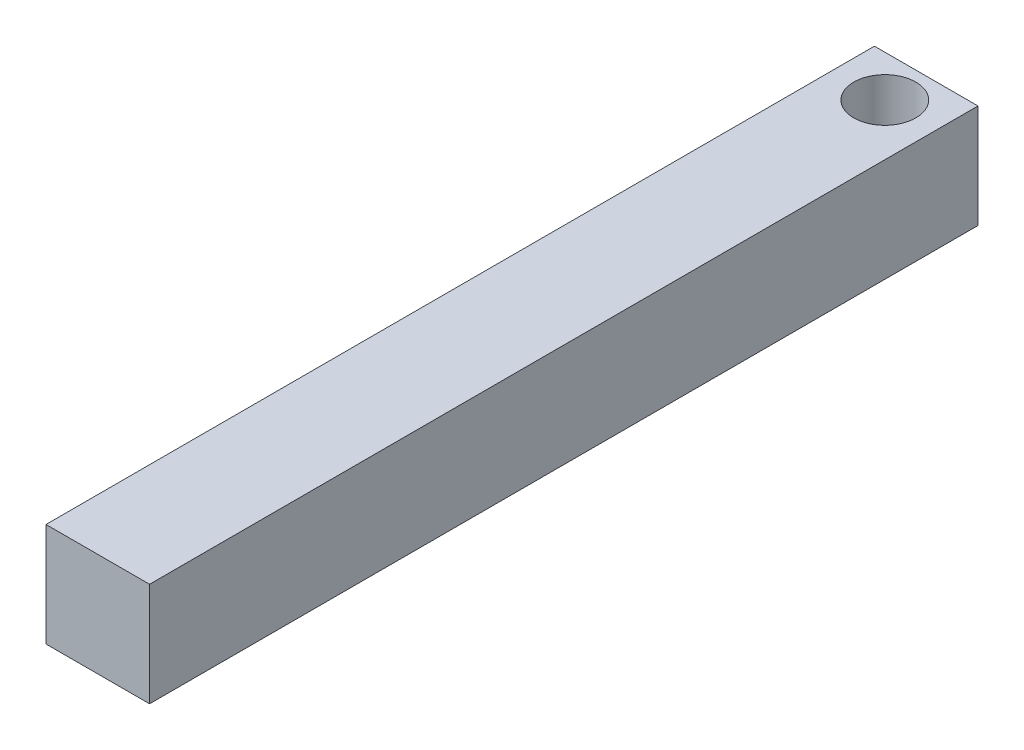
ISO-10303-21;
HEADER;
FILE_DESCRIPTION(('STEP AP214'),'2;1');
FILE_NAME('part.step','',(''),(''),'','','');
FILE_SCHEMA(('AUTOMOTIVE_DESIGN { 1 0 10303 214 1 1 1 1 }'));
ENDSEC;
DATA;
#1=APPLICATION_CONTEXT('core data for automotive mechanical design processes');
#2=APPLICATION_PROTOCOL_DEFINITION('international standard','automotive_design',2000,#1);
#3=PRODUCT_CONTEXT('',#1,'mechanical');
#4=PRODUCT('Part','Part','',(#3));
#5=PRODUCT_RELATED_PRODUCT_CATEGORY('part','',(#4));
#6=PRODUCT_DEFINITION_FORMATION('','',#4);
#7=PRODUCT_DEFINITION_CONTEXT('part definition',#1,'design');
#8=PRODUCT_DEFINITION('design','',#6,#7);
#9=PRODUCT_DEFINITION_SHAPE('','',#8);
#10=(LENGTH_UNIT() NAMED_UNIT(*) SI_UNIT(.MILLI.,.METRE.));
#11=(NAMED_UNIT(*) PLANE_ANGLE_UNIT() SI_UNIT($,.RADIAN.));
#12=(NAMED_UNIT(*) SI_UNIT($,.STERADIAN.) SOLID_ANGLE_UNIT());
#13=UNCERTAINTY_MEASURE_WITH_UNIT(LENGTH_MEASURE(1.E-05),#10,'distance_accuracy_value','');
#14=(GEOMETRIC_REPRESENTATION_CONTEXT(3) GLOBAL_UNCERTAINTY_ASSIGNED_CONTEXT((#13)) GLOBAL_UNIT_ASSIGNED_CONTEXT((#10,
#11,#12)) REPRESENTATION_CONTEXT('',''));
#15=CARTESIAN_POINT('',(0.,0.,0.));
#16=DIRECTION('',(0.,0.,1.));
#17=DIRECTION('',(1.,0.,0.));
#18=AXIS2_PLACEMENT_3D('',#15,#16,#17);
#19=CARTESIAN_POINT('',(10.,-10.,160.));
#20=DIRECTION('',(-1.,0.,0.));
#21=DIRECTION('',(0.,0.,1.));
#22=AXIS2_PLACEMENT_3D('',#19,#20,#21);
#23=PLANE('',#22);
#24=DIRECTION('',(0.,1.,0.));
#25=VECTOR('',#24,1.);
#26=CARTESIAN_POINT('',(10.,-10.,0.));
#27=LINE('',#26,#25);
#28=CARTESIAN_POINT('',(10.,-10.,0.));
#29=VERTEX_POINT('',#28);
#30=CARTESIAN_POINT('',(10.,10.,0.));
#31=VERTEX_POINT('',#30);
#32=EDGE_CURVE('E98',#29,#31,#27,.T.);
#33=ORIENTED_EDGE('',*,*,#32,.T.);
#34=DIRECTION('',(0.,0.,-1.));
#35=VECTOR('',#34,1.);
#36=CARTESIAN_POINT('',(10.,10.,160.));
#37=LINE('',#36,#35);
#38=CARTESIAN_POINT('',(10.,10.,160.));
#39=VERTEX_POINT('',#38);
#40=EDGE_CURVE('E11',#39,#31,#37,.T.);
#41=ORIENTED_EDGE('',*,*,#40,.F.);
#42=DIRECTION('',(0.,1.,0.));
#43=VECTOR('',#42,1.);
#44=CARTESIAN_POINT('',(10.,-10.,160.));
#45=LINE('',#44,#43);
#46=CARTESIAN_POINT('',(10.,-10.,160.));
#47=VERTEX_POINT('',#46);
#48=EDGE_CURVE('E85',#47,#39,#45,.T.);
#49=ORIENTED_EDGE('',*,*,#48,.F.);
#50=DIRECTION('',(0.,0.,-1.));
#51=VECTOR('',#50,1.);
#52=CARTESIAN_POINT('',(10.,-10.,160.));
#53=LINE('',#52,#51);
#54=EDGE_CURVE('E94',#47,#29,#53,.T.);
#55=ORIENTED_EDGE('',*,*,#54,.T.);
#56=EDGE_LOOP('',(#33,#41,#49,#55));
#57=FACE_BOUND('',#56,.T.);
#58=ADVANCED_FACE('F33',(#57),#23,.F.);
#59=CARTESIAN_POINT('',(-10.,10.,160.));
#60=DIRECTION('',(0.,-1.,0.));
#61=DIRECTION('',(0.,0.,-1.));
#62=AXIS2_PLACEMENT_3D('',#59,#60,#61);
#63=PLANE('',#62);
#64=CARTESIAN_POINT('',(0.,10.,8.));
#65=DIRECTION('',(0.,1.,0.));
#66=DIRECTION('',(0.,0.,1.));
#67=AXIS2_PLACEMENT_3D('',#64,#65,#66);
#68=CIRCLE('',#67,6.);
#69=CARTESIAN_POINT('',(0.,10.,14.));
#70=VERTEX_POINT('',#69);
#71=EDGE_CURVE('E111',#70,#70,#68,.T.);
#72=ORIENTED_EDGE('',*,*,#71,.F.);
#73=EDGE_LOOP('',(#72));
#74=FACE_BOUND('',#73,.T.);
#75=DIRECTION('',(-1.,0.,0.));
#76=VECTOR('',#75,1.);
#77=CARTESIAN_POINT('',(-10.,10.,0.));
#78=LINE('',#77,#76);
#79=CARTESIAN_POINT('',(-10.,10.,0.));
#80=VERTEX_POINT('',#79);
#81=EDGE_CURVE('E89',#31,#80,#78,.T.);
#82=ORIENTED_EDGE('',*,*,#81,.T.);
#83=DIRECTION('',(0.,0.,-1.));
#84=VECTOR('',#83,1.);
#85=CARTESIAN_POINT('',(-10.,10.,160.));
#86=LINE('',#85,#84);
#87=CARTESIAN_POINT('',(-10.,10.,160.));
#88=VERTEX_POINT('',#87);
#89=EDGE_CURVE('E42',#88,#80,#86,.T.);
#90=ORIENTED_EDGE('',*,*,#89,.F.);
#91=DIRECTION('',(-1.,0.,0.));
#92=VECTOR('',#91,1.);
#93=CARTESIAN_POINT('',(-10.,10.,160.));
#94=LINE('',#93,#92);
#95=EDGE_CURVE('E80',#39,#88,#94,.T.);
#96=ORIENTED_EDGE('',*,*,#95,.F.);
#97=ORIENTED_EDGE('',*,*,#40,.T.);
#98=EDGE_LOOP('',(#82,#90,#96,#97));
#99=FACE_BOUND('',#98,.T.);
#100=ADVANCED_FACE('F88',(#74,#99),#63,.F.);
#101=CARTESIAN_POINT('',(-10.,-10.,160.));
#102=DIRECTION('',(1.,0.,0.));
#103=DIRECTION('',(0.,0.,-1.));
#104=AXIS2_PLACEMENT_3D('',#101,#102,#103);
#105=PLANE('',#104);
#106=DIRECTION('',(0.,-1.,0.));
#107=VECTOR('',#106,1.);
#108=CARTESIAN_POINT('',(-10.,-10.,0.));
#109=LINE('',#108,#107);
#110=CARTESIAN_POINT('',(-10.,-10.,0.));
#111=VERTEX_POINT('',#110);
#112=EDGE_CURVE('E67',#80,#111,#109,.T.);
#113=ORIENTED_EDGE('',*,*,#112,.T.);
#114=DIRECTION('',(0.,0.,-1.));
#115=VECTOR('',#114,1.);
#116=CARTESIAN_POINT('',(-10.,-10.,160.));
#117=LINE('',#116,#115);
#118=CARTESIAN_POINT('',(-10.,-10.,160.));
#119=VERTEX_POINT('',#118);
#120=EDGE_CURVE('E90',#119,#111,#117,.T.);
#121=ORIENTED_EDGE('',*,*,#120,.F.);
#122=DIRECTION('',(0.,-1.,0.));
#123=VECTOR('',#122,1.);
#124=CARTESIAN_POINT('',(-10.,-10.,160.));
#125=LINE('',#124,#123);
#126=EDGE_CURVE('E83',#88,#119,#125,.T.);
#127=ORIENTED_EDGE('',*,*,#126,.F.);
#128=ORIENTED_EDGE('',*,*,#89,.T.);
#129=EDGE_LOOP('',(#113,#121,#127,#128));
#130=FACE_BOUND('',#129,.T.);
#131=ADVANCED_FACE('F92',(#130),#105,.F.);
#132=CARTESIAN_POINT('',(-10.,-10.,160.));
#133=DIRECTION('',(0.,1.,0.));
#134=DIRECTION('',(0.,0.,1.));
#135=AXIS2_PLACEMENT_3D('',#132,#133,#134);
#136=PLANE('',#135);
#137=CARTESIAN_POINT('',(0.,-9.99999999999999,8.));
#138=DIRECTION('',(0.,1.,0.));
#139=DIRECTION('',(0.,0.,1.));
#140=AXIS2_PLACEMENT_3D('',#137,#138,#139);
#141=CIRCLE('',#140,6.);
#142=CARTESIAN_POINT('',(0.,-9.99999999999999,14.));
#143=VERTEX_POINT('',#142);
#144=EDGE_CURVE('E36',#143,#143,#141,.T.);
#145=ORIENTED_EDGE('',*,*,#144,.T.);
#146=EDGE_LOOP('',(#145));
#147=FACE_BOUND('',#146,.T.);
#148=DIRECTION('',(1.,0.,0.));
#149=VECTOR('',#148,1.);
#150=CARTESIAN_POINT('',(-10.,-10.,0.));
#151=LINE('',#150,#149);
#152=EDGE_CURVE('E73',#111,#29,#151,.T.);
#153=ORIENTED_EDGE('',*,*,#152,.T.);
#154=ORIENTED_EDGE('',*,*,#54,.F.);
#155=DIRECTION('',(1.,0.,0.));
#156=VECTOR('',#155,1.);
#157=CARTESIAN_POINT('',(-10.,-10.,160.));
#158=LINE('',#157,#156);
#159=EDGE_CURVE('E50',#119,#47,#158,.T.);
#160=ORIENTED_EDGE('',*,*,#159,.F.);
#161=ORIENTED_EDGE('',*,*,#120,.T.);
#162=EDGE_LOOP('',(#153,#154,#160,#161));
#163=FACE_BOUND('',#162,.T.);
#164=ADVANCED_FACE('F105',(#147,#163),#136,.F.);
#165=CARTESIAN_POINT('',(0.,0.,160.));
#166=DIRECTION('',(0.,0.,-1.));
#167=DIRECTION('',(-1.,0.,0.));
#168=AXIS2_PLACEMENT_3D('',#165,#166,#167);
#169=PLANE('',#168);
#170=ORIENTED_EDGE('',*,*,#48,.T.);
#171=ORIENTED_EDGE('',*,*,#95,.T.);
#172=ORIENTED_EDGE('',*,*,#126,.T.);
#173=ORIENTED_EDGE('',*,*,#159,.T.);
#174=EDGE_LOOP('',(#170,#171,#172,#173));
#175=FACE_BOUND('',#174,.T.);
#176=ADVANCED_FACE('F81',(#175),#169,.F.);
#177=CARTESIAN_POINT('',(0.,0.,0.));
#178=DIRECTION('',(0.,0.,-1.));
#179=DIRECTION('',(-1.,0.,0.));
#180=AXIS2_PLACEMENT_3D('',#177,#178,#179);
#181=PLANE('',#180);
#182=ORIENTED_EDGE('',*,*,#32,.F.);
#183=ORIENTED_EDGE('',*,*,#152,.F.);
#184=ORIENTED_EDGE('',*,*,#112,.F.);
#185=ORIENTED_EDGE('',*,*,#81,.F.);
#186=EDGE_LOOP('',(#182,#183,#184,#185));
#187=FACE_BOUND('',#186,.T.);
#188=ADVANCED_FACE('F108',(#187),#181,.T.);
#189=CARTESIAN_POINT('',(0.,-90.,8.));
#190=DIRECTION('',(0.,1.,0.));
#191=DIRECTION('',(0.,0.,1.));
#192=AXIS2_PLACEMENT_3D('',#189,#190,#191);
#193=CYLINDRICAL_SURFACE('',#192,6.);
#194=ORIENTED_EDGE('',*,*,#71,.T.);
#195=EDGE_LOOP('',(#194));
#196=FACE_BOUND('',#195,.T.);
#197=ORIENTED_EDGE('',*,*,#144,.F.);
#198=EDGE_LOOP('',(#197));
#199=FACE_BOUND('',#198,.T.);
#200=ADVANCED_FACE('F119',(#196,#199),#193,.F.);
#201=CLOSED_SHELL('',(#58,#100,#131,#164,#176,#188,#200));
#202=MANIFOLD_SOLID_BREP('B2',#201);
#203=ADVANCED_BREP_SHAPE_REPRESENTATION('',(#18,#202),#14);
#204=SHAPE_DEFINITION_REPRESENTATION(#9,#203);
ENDSEC;
END-ISO-10303-21;
